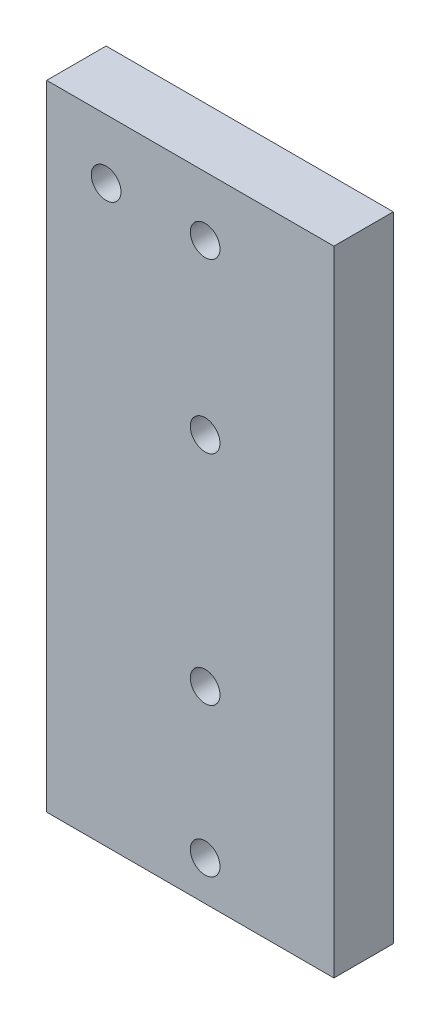
ISO-10303-21;
HEADER;
FILE_DESCRIPTION(('STEP AP214'),'2;1');
FILE_NAME('part.step','',(''),(''),'','','');
FILE_SCHEMA(('AUTOMOTIVE_DESIGN { 1 0 10303 214 1 1 1 1 }'));
ENDSEC;
DATA;
#1=APPLICATION_CONTEXT('core data for automotive mechanical design processes');
#2=APPLICATION_PROTOCOL_DEFINITION('international standard','automotive_design',2000,#1);
#3=PRODUCT_CONTEXT('',#1,'mechanical');
#4=PRODUCT('Part','Part','',(#3));
#5=PRODUCT_RELATED_PRODUCT_CATEGORY('part','',(#4));
#6=PRODUCT_DEFINITION_FORMATION('','',#4);
#7=PRODUCT_DEFINITION_CONTEXT('part definition',#1,'design');
#8=PRODUCT_DEFINITION('design','',#6,#7);
#9=PRODUCT_DEFINITION_SHAPE('','',#8);
#10=(LENGTH_UNIT() NAMED_UNIT(*) SI_UNIT(.MILLI.,.METRE.));
#11=(NAMED_UNIT(*) PLANE_ANGLE_UNIT() SI_UNIT($,.RADIAN.));
#12=(NAMED_UNIT(*) SI_UNIT($,.STERADIAN.) SOLID_ANGLE_UNIT());
#13=UNCERTAINTY_MEASURE_WITH_UNIT(LENGTH_MEASURE(1.E-05),#10,'distance_accuracy_value','');
#14=(GEOMETRIC_REPRESENTATION_CONTEXT(3) GLOBAL_UNCERTAINTY_ASSIGNED_CONTEXT((#13)) GLOBAL_UNIT_ASSIGNED_CONTEXT((#10,
#11,#12)) REPRESENTATION_CONTEXT('',''));
#15=CARTESIAN_POINT('',(0.,0.,0.));
#16=DIRECTION('',(0.,0.,1.));
#17=DIRECTION('',(1.,0.,0.));
#18=AXIS2_PLACEMENT_3D('',#15,#16,#17);
#19=CARTESIAN_POINT('',(0.,0.,30.));
#20=DIRECTION('',(0.,0.,-1.));
#21=DIRECTION('',(-1.,0.,0.));
#22=AXIS2_PLACEMENT_3D('',#19,#20,#21);
#23=PLANE('',#22);
#24=DIRECTION('',(0.,1.,0.));
#25=VECTOR('',#24,1.);
#26=CARTESIAN_POINT('',(72.5,-160.,30.));
#27=LINE('',#26,#25);
#28=CARTESIAN_POINT('',(72.5,-160.,30.));
#29=VERTEX_POINT('',#28);
#30=CARTESIAN_POINT('',(72.5,160.,30.));
#31=VERTEX_POINT('',#30);
#32=EDGE_CURVE('E96',#29,#31,#27,.T.);
#33=ORIENTED_EDGE('',*,*,#32,.T.);
#34=DIRECTION('',(-1.,0.,0.));
#35=VECTOR('',#34,1.);
#36=CARTESIAN_POINT('',(-72.5,160.,30.));
#37=LINE('',#36,#35);
#38=CARTESIAN_POINT('',(-72.5,160.,30.));
#39=VERTEX_POINT('',#38);
#40=EDGE_CURVE('E91',#31,#39,#37,.T.);
#41=ORIENTED_EDGE('',*,*,#40,.T.);
#42=DIRECTION('',(0.,-1.,0.));
#43=VECTOR('',#42,1.);
#44=CARTESIAN_POINT('',(-72.5,-160.,30.));
#45=LINE('',#44,#43);
#46=CARTESIAN_POINT('',(-72.5,-160.,30.));
#47=VERTEX_POINT('',#46);
#48=EDGE_CURVE('E94',#39,#47,#45,.T.);
#49=ORIENTED_EDGE('',*,*,#48,.T.);
#50=DIRECTION('',(1.,0.,0.));
#51=VECTOR('',#50,1.);
#52=CARTESIAN_POINT('',(-72.5,-160.,30.));
#53=LINE('',#52,#51);
#54=EDGE_CURVE('E61',#47,#29,#53,.T.);
#55=ORIENTED_EDGE('',*,*,#54,.T.);
#56=EDGE_LOOP('',(#33,#41,#49,#55));
#57=FACE_BOUND('',#56,.T.);
#58=CARTESIAN_POINT('',(7.49999999999999,130.,30.));
#59=DIRECTION('',(0.,0.,1.));
#60=DIRECTION('',(1.,0.,0.));
#61=AXIS2_PLACEMENT_3D('',#58,#59,#60);
#62=CIRCLE('',#61,7.5);
#63=CARTESIAN_POINT('',(15.,130.,30.));
#64=VERTEX_POINT('',#63);
#65=EDGE_CURVE('E116',#64,#64,#62,.T.);
#66=ORIENTED_EDGE('',*,*,#65,.F.);
#67=EDGE_LOOP('',(#66));
#68=FACE_BOUND('',#67,.T.);
#69=CARTESIAN_POINT('',(-42.5,130.,30.));
#70=DIRECTION('',(0.,0.,1.));
#71=DIRECTION('',(1.,0.,0.));
#72=AXIS2_PLACEMENT_3D('',#69,#70,#71);
#73=CIRCLE('',#72,7.5);
#74=CARTESIAN_POINT('',(-35.,130.,30.));
#75=VERTEX_POINT('',#74);
#76=EDGE_CURVE('E138',#75,#75,#73,.T.);
#77=ORIENTED_EDGE('',*,*,#76,.F.);
#78=EDGE_LOOP('',(#77));
#79=FACE_BOUND('',#78,.T.);
#80=CARTESIAN_POINT('',(7.49999999999999,-140.,30.));
#81=DIRECTION('',(0.,0.,1.));
#82=DIRECTION('',(1.,0.,0.));
#83=AXIS2_PLACEMENT_3D('',#80,#81,#82);
#84=CIRCLE('',#83,7.5);
#85=CARTESIAN_POINT('',(15.,-140.,30.));
#86=VERTEX_POINT('',#85);
#87=EDGE_CURVE('E146',#86,#86,#84,.T.);
#88=ORIENTED_EDGE('',*,*,#87,.F.);
#89=EDGE_LOOP('',(#88));
#90=FACE_BOUND('',#89,.T.);
#91=CARTESIAN_POINT('',(7.49999999999999,45.,30.));
#92=DIRECTION('',(0.,0.,1.));
#93=DIRECTION('',(1.,0.,0.));
#94=AXIS2_PLACEMENT_3D('',#91,#92,#93);
#95=CIRCLE('',#94,7.5);
#96=CARTESIAN_POINT('',(15.,45.,30.));
#97=VERTEX_POINT('',#96);
#98=EDGE_CURVE('E154',#97,#97,#95,.T.);
#99=ORIENTED_EDGE('',*,*,#98,.F.);
#100=EDGE_LOOP('',(#99));
#101=FACE_BOUND('',#100,.T.);
#102=CARTESIAN_POINT('',(7.49999999999999,-65.,30.));
#103=DIRECTION('',(0.,0.,1.));
#104=DIRECTION('',(1.,0.,0.));
#105=AXIS2_PLACEMENT_3D('',#102,#103,#104);
#106=CIRCLE('',#105,7.5);
#107=CARTESIAN_POINT('',(15.,-65.,30.));
#108=VERTEX_POINT('',#107);
#109=EDGE_CURVE('E162',#108,#108,#106,.T.);
#110=ORIENTED_EDGE('',*,*,#109,.F.);
#111=EDGE_LOOP('',(#110));
#112=FACE_BOUND('',#111,.T.);
#113=ADVANCED_FACE('F43',(#57,#68,#79,#90,#101,#112),#23,.F.);
#114=CARTESIAN_POINT('',(0.,0.,0.));
#115=DIRECTION('',(0.,0.,-1.));
#116=DIRECTION('',(-1.,0.,0.));
#117=AXIS2_PLACEMENT_3D('',#114,#115,#116);
#118=PLANE('',#117);
#119=CARTESIAN_POINT('',(7.49999999999999,45.,0.));
#120=DIRECTION('',(0.,0.,1.));
#121=DIRECTION('',(1.,0.,0.));
#122=AXIS2_PLACEMENT_3D('',#119,#120,#121);
#123=CIRCLE('',#122,7.5);
#124=CARTESIAN_POINT('',(15.,45.,0.));
#125=VERTEX_POINT('',#124);
#126=EDGE_CURVE('E158',#125,#125,#123,.T.);
#127=ORIENTED_EDGE('',*,*,#126,.T.);
#128=EDGE_LOOP('',(#127));
#129=FACE_BOUND('',#128,.T.);
#130=CARTESIAN_POINT('',(-42.5,130.,0.));
#131=DIRECTION('',(0.,0.,1.));
#132=DIRECTION('',(1.,0.,0.));
#133=AXIS2_PLACEMENT_3D('',#130,#131,#132);
#134=CIRCLE('',#133,7.5);
#135=CARTESIAN_POINT('',(-35.,130.,0.));
#136=VERTEX_POINT('',#135);
#137=EDGE_CURVE('E142',#136,#136,#134,.T.);
#138=ORIENTED_EDGE('',*,*,#137,.T.);
#139=EDGE_LOOP('',(#138));
#140=FACE_BOUND('',#139,.T.);
#141=DIRECTION('',(0.,1.,0.));
#142=VECTOR('',#141,1.);
#143=CARTESIAN_POINT('',(72.5,-160.,0.));
#144=LINE('',#143,#142);
#145=CARTESIAN_POINT('',(72.5,-160.,0.));
#146=VERTEX_POINT('',#145);
#147=CARTESIAN_POINT('',(72.5,160.,0.));
#148=VERTEX_POINT('',#147);
#149=EDGE_CURVE('E112',#146,#148,#144,.T.);
#150=ORIENTED_EDGE('',*,*,#149,.F.);
#151=DIRECTION('',(1.,0.,0.));
#152=VECTOR('',#151,1.);
#153=CARTESIAN_POINT('',(-72.5,-160.,0.));
#154=LINE('',#153,#152);
#155=CARTESIAN_POINT('',(-72.5,-160.,0.));
#156=VERTEX_POINT('',#155);
#157=EDGE_CURVE('E84',#156,#146,#154,.T.);
#158=ORIENTED_EDGE('',*,*,#157,.F.);
#159=DIRECTION('',(0.,-1.,0.));
#160=VECTOR('',#159,1.);
#161=CARTESIAN_POINT('',(-72.5,-160.,0.));
#162=LINE('',#161,#160);
#163=CARTESIAN_POINT('',(-72.5,160.,0.));
#164=VERTEX_POINT('',#163);
#165=EDGE_CURVE('E78',#164,#156,#162,.T.);
#166=ORIENTED_EDGE('',*,*,#165,.F.);
#167=DIRECTION('',(-1.,0.,0.));
#168=VECTOR('',#167,1.);
#169=CARTESIAN_POINT('',(-72.5,160.,0.));
#170=LINE('',#169,#168);
#171=EDGE_CURVE('E101',#148,#164,#170,.T.);
#172=ORIENTED_EDGE('',*,*,#171,.F.);
#173=EDGE_LOOP('',(#150,#158,#166,#172));
#174=FACE_BOUND('',#173,.T.);
#175=CARTESIAN_POINT('',(7.49999999999999,130.,0.));
#176=DIRECTION('',(0.,0.,1.));
#177=DIRECTION('',(1.,0.,0.));
#178=AXIS2_PLACEMENT_3D('',#175,#176,#177);
#179=CIRCLE('',#178,7.5);
#180=CARTESIAN_POINT('',(15.,130.,0.));
#181=VERTEX_POINT('',#180);
#182=EDGE_CURVE('E134',#181,#181,#179,.T.);
#183=ORIENTED_EDGE('',*,*,#182,.T.);
#184=EDGE_LOOP('',(#183));
#185=FACE_BOUND('',#184,.T.);
#186=CARTESIAN_POINT('',(7.49999999999999,-140.,0.));
#187=DIRECTION('',(0.,0.,1.));
#188=DIRECTION('',(1.,0.,0.));
#189=AXIS2_PLACEMENT_3D('',#186,#187,#188);
#190=CIRCLE('',#189,7.5);
#191=CARTESIAN_POINT('',(15.,-140.,0.));
#192=VERTEX_POINT('',#191);
#193=EDGE_CURVE('E150',#192,#192,#190,.T.);
#194=ORIENTED_EDGE('',*,*,#193,.T.);
#195=EDGE_LOOP('',(#194));
#196=FACE_BOUND('',#195,.T.);
#197=CARTESIAN_POINT('',(7.49999999999999,-65.,0.));
#198=DIRECTION('',(0.,0.,1.));
#199=DIRECTION('',(1.,0.,0.));
#200=AXIS2_PLACEMENT_3D('',#197,#198,#199);
#201=CIRCLE('',#200,7.5);
#202=CARTESIAN_POINT('',(15.,-65.,0.));
#203=VERTEX_POINT('',#202);
#204=EDGE_CURVE('E166',#203,#203,#201,.T.);
#205=ORIENTED_EDGE('',*,*,#204,.T.);
#206=EDGE_LOOP('',(#205));
#207=FACE_BOUND('',#206,.T.);
#208=ADVANCED_FACE('F129',(#129,#140,#174,#185,#196,#207),#118,.T.);
#209=CARTESIAN_POINT('',(72.5,-160.,30.));
#210=DIRECTION('',(-1.,0.,0.));
#211=DIRECTION('',(0.,0.,1.));
#212=AXIS2_PLACEMENT_3D('',#209,#210,#211);
#213=PLANE('',#212);
#214=ORIENTED_EDGE('',*,*,#149,.T.);
#215=DIRECTION('',(0.,0.,-1.));
#216=VECTOR('',#215,1.);
#217=CARTESIAN_POINT('',(72.5,160.,30.));
#218=LINE('',#217,#216);
#219=EDGE_CURVE('E11',#31,#148,#218,.T.);
#220=ORIENTED_EDGE('',*,*,#219,.F.);
#221=ORIENTED_EDGE('',*,*,#32,.F.);
#222=DIRECTION('',(0.,0.,-1.));
#223=VECTOR('',#222,1.);
#224=CARTESIAN_POINT('',(72.5,-160.,30.));
#225=LINE('',#224,#223);
#226=EDGE_CURVE('E108',#29,#146,#225,.T.);
#227=ORIENTED_EDGE('',*,*,#226,.T.);
#228=EDGE_LOOP('',(#214,#220,#221,#227));
#229=FACE_BOUND('',#228,.T.);
#230=ADVANCED_FACE('F45',(#229),#213,.F.);
#231=CARTESIAN_POINT('',(-72.5,160.,30.));
#232=DIRECTION('',(0.,-1.,0.));
#233=DIRECTION('',(0.,0.,-1.));
#234=AXIS2_PLACEMENT_3D('',#231,#232,#233);
#235=PLANE('',#234);
#236=ORIENTED_EDGE('',*,*,#171,.T.);
#237=DIRECTION('',(0.,0.,-1.));
#238=VECTOR('',#237,1.);
#239=CARTESIAN_POINT('',(-72.5,160.,30.));
#240=LINE('',#239,#238);
#241=EDGE_CURVE('E53',#39,#164,#240,.T.);
#242=ORIENTED_EDGE('',*,*,#241,.F.);
#243=ORIENTED_EDGE('',*,*,#40,.F.);
#244=ORIENTED_EDGE('',*,*,#219,.T.);
#245=EDGE_LOOP('',(#236,#242,#243,#244));
#246=FACE_BOUND('',#245,.T.);
#247=ADVANCED_FACE('F100',(#246),#235,.F.);
#248=CARTESIAN_POINT('',(-72.5,-160.,30.));
#249=DIRECTION('',(1.,0.,0.));
#250=DIRECTION('',(0.,0.,-1.));
#251=AXIS2_PLACEMENT_3D('',#248,#249,#250);
#252=PLANE('',#251);
#253=ORIENTED_EDGE('',*,*,#165,.T.);
#254=DIRECTION('',(0.,0.,-1.));
#255=VECTOR('',#254,1.);
#256=CARTESIAN_POINT('',(-72.5,-160.,30.));
#257=LINE('',#256,#255);
#258=EDGE_CURVE('E103',#47,#156,#257,.T.);
#259=ORIENTED_EDGE('',*,*,#258,.F.);
#260=ORIENTED_EDGE('',*,*,#48,.F.);
#261=ORIENTED_EDGE('',*,*,#241,.T.);
#262=EDGE_LOOP('',(#253,#259,#260,#261));
#263=FACE_BOUND('',#262,.T.);
#264=ADVANCED_FACE('F104',(#263),#252,.F.);
#265=CARTESIAN_POINT('',(-72.5,-160.,30.));
#266=DIRECTION('',(0.,1.,0.));
#267=DIRECTION('',(0.,0.,1.));
#268=AXIS2_PLACEMENT_3D('',#265,#266,#267);
#269=PLANE('',#268);
#270=ORIENTED_EDGE('',*,*,#157,.T.);
#271=ORIENTED_EDGE('',*,*,#226,.F.);
#272=ORIENTED_EDGE('',*,*,#54,.F.);
#273=ORIENTED_EDGE('',*,*,#258,.T.);
#274=EDGE_LOOP('',(#270,#271,#272,#273));
#275=FACE_BOUND('',#274,.T.);
#276=ADVANCED_FACE('F126',(#275),#269,.F.);
#277=CARTESIAN_POINT('',(7.49999999999999,130.,30.));
#278=DIRECTION('',(0.,0.,-1.));
#279=DIRECTION('',(-1.,0.,0.));
#280=AXIS2_PLACEMENT_3D('',#277,#278,#279);
#281=CYLINDRICAL_SURFACE('',#280,7.5);
#282=ORIENTED_EDGE('',*,*,#65,.T.);
#283=EDGE_LOOP('',(#282));
#284=FACE_BOUND('',#283,.T.);
#285=ORIENTED_EDGE('',*,*,#182,.F.);
#286=EDGE_LOOP('',(#285));
#287=FACE_BOUND('',#286,.T.);
#288=ADVANCED_FACE('F185',(#284,#287),#281,.F.);
#289=CARTESIAN_POINT('',(-42.5,130.,30.));
#290=DIRECTION('',(0.,0.,-1.));
#291=DIRECTION('',(-1.,0.,0.));
#292=AXIS2_PLACEMENT_3D('',#289,#290,#291);
#293=CYLINDRICAL_SURFACE('',#292,7.5);
#294=ORIENTED_EDGE('',*,*,#76,.T.);
#295=EDGE_LOOP('',(#294));
#296=FACE_BOUND('',#295,.T.);
#297=ORIENTED_EDGE('',*,*,#137,.F.);
#298=EDGE_LOOP('',(#297));
#299=FACE_BOUND('',#298,.T.);
#300=ADVANCED_FACE('F239',(#296,#299),#293,.F.);
#301=CARTESIAN_POINT('',(7.49999999999999,-140.,30.));
#302=DIRECTION('',(0.,0.,-1.));
#303=DIRECTION('',(-1.,0.,0.));
#304=AXIS2_PLACEMENT_3D('',#301,#302,#303);
#305=CYLINDRICAL_SURFACE('',#304,7.5);
#306=ORIENTED_EDGE('',*,*,#87,.T.);
#307=EDGE_LOOP('',(#306));
#308=FACE_BOUND('',#307,.T.);
#309=ORIENTED_EDGE('',*,*,#193,.F.);
#310=EDGE_LOOP('',(#309));
#311=FACE_BOUND('',#310,.T.);
#312=ADVANCED_FACE('F248',(#308,#311),#305,.F.);
#313=CARTESIAN_POINT('',(7.49999999999999,45.,30.));
#314=DIRECTION('',(0.,0.,-1.));
#315=DIRECTION('',(-1.,0.,0.));
#316=AXIS2_PLACEMENT_3D('',#313,#314,#315);
#317=CYLINDRICAL_SURFACE('',#316,7.5);
#318=ORIENTED_EDGE('',*,*,#98,.T.);
#319=EDGE_LOOP('',(#318));
#320=FACE_BOUND('',#319,.T.);
#321=ORIENTED_EDGE('',*,*,#126,.F.);
#322=EDGE_LOOP('',(#321));
#323=FACE_BOUND('',#322,.T.);
#324=ADVANCED_FACE('F257',(#320,#323),#317,.F.);
#325=CARTESIAN_POINT('',(7.49999999999999,-65.,30.));
#326=DIRECTION('',(0.,0.,-1.));
#327=DIRECTION('',(-1.,0.,0.));
#328=AXIS2_PLACEMENT_3D('',#325,#326,#327);
#329=CYLINDRICAL_SURFACE('',#328,7.5);
#330=ORIENTED_EDGE('',*,*,#109,.T.);
#331=EDGE_LOOP('',(#330));
#332=FACE_BOUND('',#331,.T.);
#333=ORIENTED_EDGE('',*,*,#204,.F.);
#334=EDGE_LOOP('',(#333));
#335=FACE_BOUND('',#334,.T.);
#336=ADVANCED_FACE('F174',(#332,#335),#329,.F.);
#337=CLOSED_SHELL('',(#113,#208,#230,#247,#264,#276,#288,#300,#312,#324,#336));
#338=MANIFOLD_SOLID_BREP('B2',#337);
#339=ADVANCED_BREP_SHAPE_REPRESENTATION('',(#18,#338),#14);
#340=SHAPE_DEFINITION_REPRESENTATION(#9,#339);
ENDSEC;
END-ISO-10303-21;
